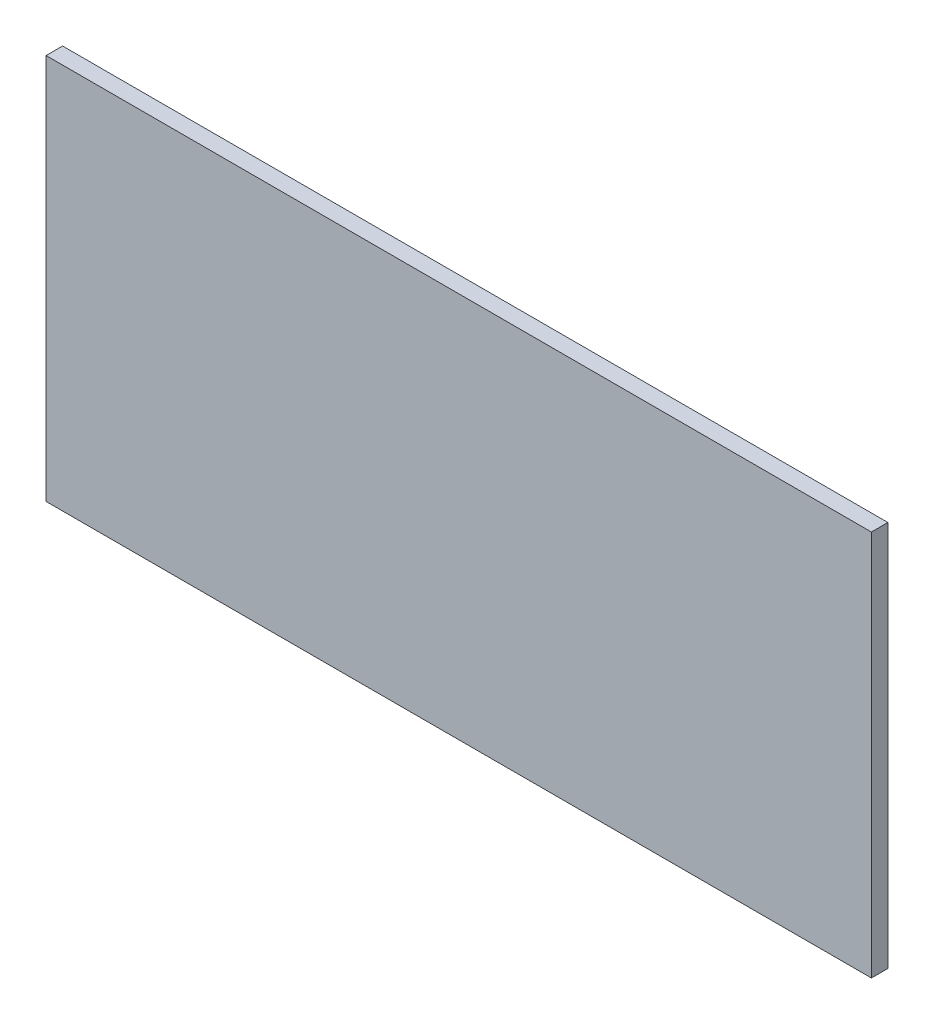
ISO-10303-21;
HEADER;
FILE_DESCRIPTION(('STEP AP214'),'2;1');
FILE_NAME('part.step','',(''),(''),'','','');
FILE_SCHEMA(('AUTOMOTIVE_DESIGN { 1 0 10303 214 1 1 1 1 }'));
ENDSEC;
DATA;
#1=APPLICATION_CONTEXT('core data for automotive mechanical design processes');
#2=APPLICATION_PROTOCOL_DEFINITION('international standard','automotive_design',2000,#1);
#3=PRODUCT_CONTEXT('',#1,'mechanical');
#4=PRODUCT('Part','Part','',(#3));
#5=PRODUCT_RELATED_PRODUCT_CATEGORY('part','',(#4));
#6=PRODUCT_DEFINITION_FORMATION('','',#4);
#7=PRODUCT_DEFINITION_CONTEXT('part definition',#1,'design');
#8=PRODUCT_DEFINITION('design','',#6,#7);
#9=PRODUCT_DEFINITION_SHAPE('','',#8);
#10=(LENGTH_UNIT() NAMED_UNIT(*) SI_UNIT(.MILLI.,.METRE.));
#11=(NAMED_UNIT(*) PLANE_ANGLE_UNIT() SI_UNIT($,.RADIAN.));
#12=(NAMED_UNIT(*) SI_UNIT($,.STERADIAN.) SOLID_ANGLE_UNIT());
#13=UNCERTAINTY_MEASURE_WITH_UNIT(LENGTH_MEASURE(1.E-05),#10,'distance_accuracy_value','');
#14=(GEOMETRIC_REPRESENTATION_CONTEXT(3) GLOBAL_UNCERTAINTY_ASSIGNED_CONTEXT((#13)) GLOBAL_UNIT_ASSIGNED_CONTEXT((#10,
#11,#12)) REPRESENTATION_CONTEXT('',''));
#15=CARTESIAN_POINT('',(0.,0.,0.));
#16=DIRECTION('',(0.,0.,1.));
#17=DIRECTION('',(1.,0.,0.));
#18=AXIS2_PLACEMENT_3D('',#15,#16,#17);
#19=CARTESIAN_POINT('',(-50.,11.7,1.));
#20=DIRECTION('',(1.,0.,0.));
#21=DIRECTION('',(0.,0.,-1.));
#22=AXIS2_PLACEMENT_3D('',#19,#20,#21);
#23=PLANE('',#22);
#24=DIRECTION('',(0.,-1.,0.));
#25=VECTOR('',#24,1.);
#26=CARTESIAN_POINT('',(-50.,11.7,0.));
#27=LINE('',#26,#25);
#28=CARTESIAN_POINT('',(-50.,11.7,0.));
#29=VERTEX_POINT('',#28);
#30=CARTESIAN_POINT('',(-50.,-11.7,0.));
#31=VERTEX_POINT('',#30);
#32=EDGE_CURVE('E104',#29,#31,#27,.T.);
#33=ORIENTED_EDGE('',*,*,#32,.T.);
#34=DIRECTION('',(0.,0.,-1.));
#35=VECTOR('',#34,1.);
#36=CARTESIAN_POINT('',(-50.,-11.7,1.));
#37=LINE('',#36,#35);
#38=CARTESIAN_POINT('',(-50.,-11.7,1.));
#39=VERTEX_POINT('',#38);
#40=EDGE_CURVE('E11',#39,#31,#37,.T.);
#41=ORIENTED_EDGE('',*,*,#40,.F.);
#42=DIRECTION('',(0.,-1.,0.));
#43=VECTOR('',#42,1.);
#44=CARTESIAN_POINT('',(-50.,11.7,1.));
#45=LINE('',#44,#43);
#46=CARTESIAN_POINT('',(-50.,11.7,1.));
#47=VERTEX_POINT('',#46);
#48=EDGE_CURVE('E92',#47,#39,#45,.T.);
#49=ORIENTED_EDGE('',*,*,#48,.F.);
#50=DIRECTION('',(0.,0.,-1.));
#51=VECTOR('',#50,1.);
#52=CARTESIAN_POINT('',(-50.,11.7,1.));
#53=LINE('',#52,#51);
#54=EDGE_CURVE('E100',#47,#29,#53,.T.);
#55=ORIENTED_EDGE('',*,*,#54,.T.);
#56=EDGE_LOOP('',(#33,#41,#49,#55));
#57=FACE_BOUND('',#56,.T.);
#58=ADVANCED_FACE('F41',(#57),#23,.F.);
#59=CARTESIAN_POINT('',(-50.,-11.7,1.));
#60=DIRECTION('',(0.,1.,0.));
#61=DIRECTION('',(0.,0.,1.));
#62=AXIS2_PLACEMENT_3D('',#59,#60,#61);
#63=PLANE('',#62);
#64=DIRECTION('',(1.,0.,0.));
#65=VECTOR('',#64,1.);
#66=CARTESIAN_POINT('',(-50.,-11.7,0.));
#67=LINE('',#66,#65);
#68=CARTESIAN_POINT('',(0.,-11.7,0.));
#69=VERTEX_POINT('',#68);
#70=EDGE_CURVE('E96',#31,#69,#67,.T.);
#71=ORIENTED_EDGE('',*,*,#70,.T.);
#72=DIRECTION('',(0.,0.,-1.));
#73=VECTOR('',#72,1.);
#74=CARTESIAN_POINT('',(0.,-11.7,1.));
#75=LINE('',#74,#73);
#76=CARTESIAN_POINT('',(0.,-11.7,1.));
#77=VERTEX_POINT('',#76);
#78=EDGE_CURVE('E49',#77,#69,#75,.T.);
#79=ORIENTED_EDGE('',*,*,#78,.F.);
#80=DIRECTION('',(1.,0.,0.));
#81=VECTOR('',#80,1.);
#82=CARTESIAN_POINT('',(-50.,-11.7,1.));
#83=LINE('',#82,#81);
#84=EDGE_CURVE('E87',#39,#77,#83,.T.);
#85=ORIENTED_EDGE('',*,*,#84,.F.);
#86=ORIENTED_EDGE('',*,*,#40,.T.);
#87=EDGE_LOOP('',(#71,#79,#85,#86));
#88=FACE_BOUND('',#87,.T.);
#89=ADVANCED_FACE('F95',(#88),#63,.F.);
#90=CARTESIAN_POINT('',(0.,11.7,1.));
#91=DIRECTION('',(-1.,0.,0.));
#92=DIRECTION('',(0.,0.,1.));
#93=AXIS2_PLACEMENT_3D('',#90,#91,#92);
#94=PLANE('',#93);
#95=DIRECTION('',(0.,1.,0.));
#96=VECTOR('',#95,1.);
#97=CARTESIAN_POINT('',(0.,11.7,0.));
#98=LINE('',#97,#96);
#99=CARTESIAN_POINT('',(0.,11.7,0.));
#100=VERTEX_POINT('',#99);
#101=EDGE_CURVE('E74',#69,#100,#98,.T.);
#102=ORIENTED_EDGE('',*,*,#101,.T.);
#103=DIRECTION('',(0.,0.,-1.));
#104=VECTOR('',#103,1.);
#105=CARTESIAN_POINT('',(0.,11.7,1.));
#106=LINE('',#105,#104);
#107=CARTESIAN_POINT('',(0.,11.7,1.));
#108=VERTEX_POINT('',#107);
#109=EDGE_CURVE('E97',#108,#100,#106,.T.);
#110=ORIENTED_EDGE('',*,*,#109,.F.);
#111=DIRECTION('',(0.,1.,0.));
#112=VECTOR('',#111,1.);
#113=CARTESIAN_POINT('',(0.,11.7,1.));
#114=LINE('',#113,#112);
#115=EDGE_CURVE('E90',#77,#108,#114,.T.);
#116=ORIENTED_EDGE('',*,*,#115,.F.);
#117=ORIENTED_EDGE('',*,*,#78,.T.);
#118=EDGE_LOOP('',(#102,#110,#116,#117));
#119=FACE_BOUND('',#118,.T.);
#120=ADVANCED_FACE('F98',(#119),#94,.F.);
#121=CARTESIAN_POINT('',(-50.,11.7,1.));
#122=DIRECTION('',(0.,-1.,0.));
#123=DIRECTION('',(0.,0.,-1.));
#124=AXIS2_PLACEMENT_3D('',#121,#122,#123);
#125=PLANE('',#124);
#126=DIRECTION('',(-1.,0.,0.));
#127=VECTOR('',#126,1.);
#128=CARTESIAN_POINT('',(-50.,11.7,0.));
#129=LINE('',#128,#127);
#130=EDGE_CURVE('E80',#100,#29,#129,.T.);
#131=ORIENTED_EDGE('',*,*,#130,.T.);
#132=ORIENTED_EDGE('',*,*,#54,.F.);
#133=DIRECTION('',(-1.,0.,0.));
#134=VECTOR('',#133,1.);
#135=CARTESIAN_POINT('',(-50.,11.7,1.));
#136=LINE('',#135,#134);
#137=EDGE_CURVE('E57',#108,#47,#136,.T.);
#138=ORIENTED_EDGE('',*,*,#137,.F.);
#139=ORIENTED_EDGE('',*,*,#109,.T.);
#140=EDGE_LOOP('',(#131,#132,#138,#139));
#141=FACE_BOUND('',#140,.T.);
#142=ADVANCED_FACE('F111',(#141),#125,.F.);
#143=CARTESIAN_POINT('',(0.,0.,1.));
#144=DIRECTION('',(0.,0.,1.));
#145=DIRECTION('',(1.,0.,0.));
#146=AXIS2_PLACEMENT_3D('',#143,#144,#145);
#147=PLANE('',#146);
#148=ORIENTED_EDGE('',*,*,#48,.T.);
#149=ORIENTED_EDGE('',*,*,#84,.T.);
#150=ORIENTED_EDGE('',*,*,#115,.T.);
#151=ORIENTED_EDGE('',*,*,#137,.T.);
#152=EDGE_LOOP('',(#148,#149,#150,#151));
#153=FACE_BOUND('',#152,.T.);
#154=ADVANCED_FACE('F88',(#153),#147,.T.);
#155=CARTESIAN_POINT('',(0.,0.,0.));
#156=DIRECTION('',(0.,0.,1.));
#157=DIRECTION('',(1.,0.,0.));
#158=AXIS2_PLACEMENT_3D('',#155,#156,#157);
#159=PLANE('',#158);
#160=ORIENTED_EDGE('',*,*,#32,.F.);
#161=ORIENTED_EDGE('',*,*,#130,.F.);
#162=ORIENTED_EDGE('',*,*,#101,.F.);
#163=ORIENTED_EDGE('',*,*,#70,.F.);
#164=EDGE_LOOP('',(#160,#161,#162,#163));
#165=FACE_BOUND('',#164,.T.);
#166=ADVANCED_FACE('F114',(#165),#159,.F.);
#167=CLOSED_SHELL('',(#58,#89,#120,#142,#154,#166));
#168=MANIFOLD_SOLID_BREP('B2',#167);
#169=ADVANCED_BREP_SHAPE_REPRESENTATION('',(#18,#168),#14);
#170=SHAPE_DEFINITION_REPRESENTATION(#9,#169);
ENDSEC;
END-ISO-10303-21;
